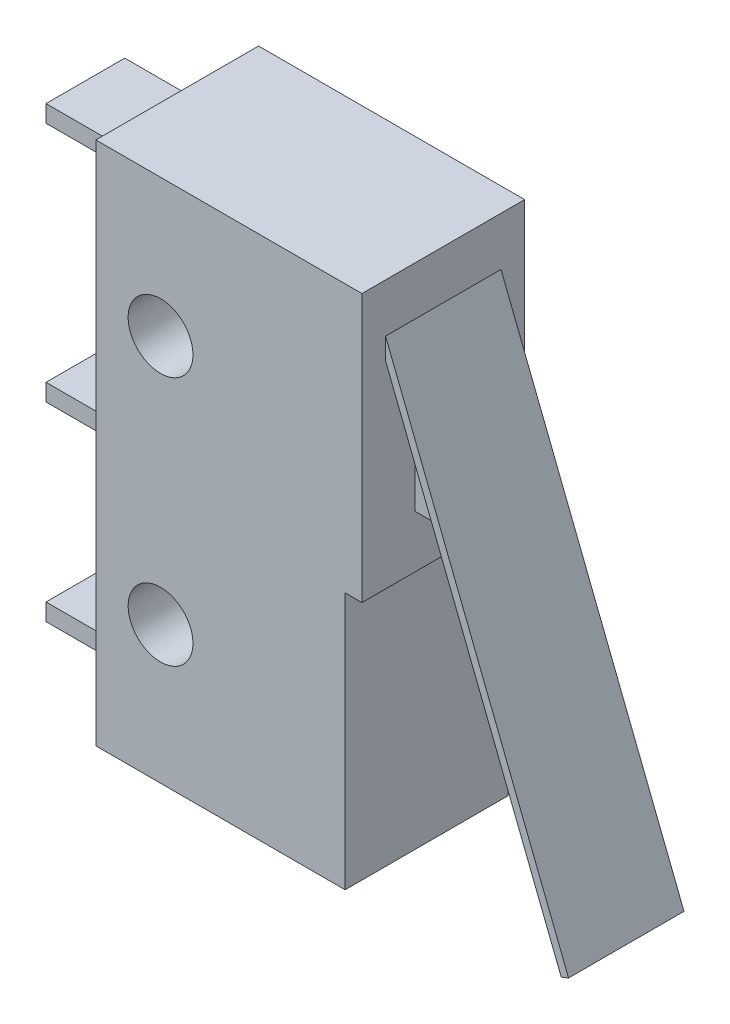
ISO-10303-21;
HEADER;
FILE_DESCRIPTION(('STEP AP214'),'2;1');
FILE_NAME('part.step','',(''),(''),'','','');
FILE_SCHEMA(('AUTOMOTIVE_DESIGN { 1 0 10303 214 1 1 1 1 }'));
ENDSEC;
DATA;
#1=APPLICATION_CONTEXT('core data for automotive mechanical design processes');
#2=APPLICATION_PROTOCOL_DEFINITION('international standard','automotive_design',2000,#1);
#3=PRODUCT_CONTEXT('',#1,'mechanical');
#4=PRODUCT('Part','Part','',(#3));
#5=PRODUCT_RELATED_PRODUCT_CATEGORY('part','',(#4));
#6=PRODUCT_DEFINITION_FORMATION('','',#4);
#7=PRODUCT_DEFINITION_CONTEXT('part definition',#1,'design');
#8=PRODUCT_DEFINITION('design','',#6,#7);
#9=PRODUCT_DEFINITION_SHAPE('','',#8);
#10=(LENGTH_UNIT() NAMED_UNIT(*) SI_UNIT(.MILLI.,.METRE.));
#11=(NAMED_UNIT(*) PLANE_ANGLE_UNIT() SI_UNIT($,.RADIAN.));
#12=(NAMED_UNIT(*) SI_UNIT($,.STERADIAN.) SOLID_ANGLE_UNIT());
#13=UNCERTAINTY_MEASURE_WITH_UNIT(LENGTH_MEASURE(1.E-05),#10,'distance_accuracy_value','');
#14=(GEOMETRIC_REPRESENTATION_CONTEXT(3) GLOBAL_UNCERTAINTY_ASSIGNED_CONTEXT((#13)) GLOBAL_UNIT_ASSIGNED_CONTEXT((#10,
#11,#12)) REPRESENTATION_CONTEXT('',''));
#15=CARTESIAN_POINT('',(0.,0.,0.));
#16=DIRECTION('',(0.,0.,1.));
#17=DIRECTION('',(1.,0.,0.));
#18=AXIS2_PLACEMENT_3D('',#15,#16,#17);
#19=CARTESIAN_POINT('',(-2.51649635036497,7.9684502392128,0.9));
#20=DIRECTION('',(-0.366577263450743,0.930387612729751,0.));
#21=DIRECTION('',(-0.930387612729751,-0.366577263450743,0.));
#22=AXIS2_PLACEMENT_3D('',#19,#20,#21);
#23=PLANE('',#22);
#24=DIRECTION('',(0.,0.,1.));
#25=VECTOR('',#24,1.);
#26=CARTESIAN_POINT('',(-2.79561263418389,7.85847706017758,0.9));
#27=LINE('',#26,#25);
#28=CARTESIAN_POINT('',(-2.79561263418389,7.85847706017758,0.9));
#29=VERTEX_POINT('',#28);
#30=CARTESIAN_POINT('',(-2.79561263418389,7.85847706017758,5.3));
#31=VERTEX_POINT('',#30);
#32=EDGE_CURVE('E54',#29,#31,#27,.T.);
#33=ORIENTED_EDGE('',*,*,#32,.T.);
#34=DIRECTION('',(-0.930387612729751,-0.366577263450743,0.));
#35=VECTOR('',#34,1.);
#36=CARTESIAN_POINT('',(-2.51649635036497,7.9684502392128,5.3));
#37=LINE('',#36,#35);
#38=CARTESIAN_POINT('',(-2.51649635036497,7.9684502392128,5.3));
#39=VERTEX_POINT('',#38);
#40=EDGE_CURVE('E96',#39,#31,#37,.T.);
#41=ORIENTED_EDGE('',*,*,#40,.F.);
#42=DIRECTION('',(0.,0.,1.));
#43=VECTOR('',#42,1.);
#44=CARTESIAN_POINT('',(-2.51649635036497,7.9684502392128,0.9));
#45=LINE('',#44,#43);
#46=CARTESIAN_POINT('',(-2.51649635036497,7.9684502392128,0.9));
#47=VERTEX_POINT('',#46);
#48=EDGE_CURVE('E12',#47,#39,#45,.T.);
#49=ORIENTED_EDGE('',*,*,#48,.F.);
#50=DIRECTION('',(-0.930387612729751,-0.366577263450743,0.));
#51=VECTOR('',#50,1.);
#52=CARTESIAN_POINT('',(-2.51649635036497,7.9684502392128,0.9));
#53=LINE('',#52,#51);
#54=EDGE_CURVE('E97',#47,#29,#53,.T.);
#55=ORIENTED_EDGE('',*,*,#54,.T.);
#56=EDGE_LOOP('',(#33,#41,#49,#55));
#57=FACE_BOUND('',#56,.T.);
#58=ADVANCED_FACE('F51',(#57),#23,.T.);
#59=CARTESIAN_POINT('',(-2.51649635036497,7.9684502392128,0.9));
#60=DIRECTION('',(0.930387612729752,0.36657726345074,0.));
#61=DIRECTION('',(-0.36657726345074,0.930387612729752,0.));
#62=AXIS2_PLACEMENT_3D('',#59,#60,#61);
#63=PLANE('',#62);
#64=ORIENTED_EDGE('',*,*,#48,.T.);
#65=DIRECTION('',(-0.36657726345074,0.930387612729752,0.));
#66=VECTOR('',#65,1.);
#67=CARTESIAN_POINT('',(-2.51649635036497,7.9684502392128,5.3));
#68=LINE('',#67,#66);
#69=CARTESIAN_POINT('',(4.45730950370691,-9.73134521218348,5.3));
#70=VERTEX_POINT('',#69);
#71=EDGE_CURVE('E115',#70,#39,#68,.T.);
#72=ORIENTED_EDGE('',*,*,#71,.F.);
#73=DIRECTION('',(0.,0.,1.));
#74=VECTOR('',#73,1.);
#75=CARTESIAN_POINT('',(4.45730950370691,-9.73134521218348,0.9));
#76=LINE('',#75,#74);
#77=CARTESIAN_POINT('',(4.45730950370691,-9.73134521218348,0.9));
#78=VERTEX_POINT('',#77);
#79=EDGE_CURVE('E60',#78,#70,#76,.T.);
#80=ORIENTED_EDGE('',*,*,#79,.F.);
#81=DIRECTION('',(-0.36657726345074,0.930387612729752,0.));
#82=VECTOR('',#81,1.);
#83=CARTESIAN_POINT('',(-2.51649635036497,7.9684502392128,0.9));
#84=LINE('',#83,#82);
#85=EDGE_CURVE('E103',#78,#47,#84,.T.);
#86=ORIENTED_EDGE('',*,*,#85,.T.);
#87=EDGE_LOOP('',(#64,#72,#80,#86));
#88=FACE_BOUND('',#87,.T.);
#89=ADVANCED_FACE('F135',(#88),#63,.T.);
#90=CARTESIAN_POINT('',(4.45730950370691,-9.73134521218348,0.9));
#91=DIRECTION('',(0.36657726345074,-0.930387612729752,0.));
#92=DIRECTION('',(0.930387612729752,0.36657726345074,0.));
#93=AXIS2_PLACEMENT_3D('',#90,#91,#92);
#94=PLANE('',#93);
#95=ORIENTED_EDGE('',*,*,#79,.T.);
#96=DIRECTION('',(0.930387612729752,0.36657726345074,0.));
#97=VECTOR('',#96,1.);
#98=CARTESIAN_POINT('',(4.45730950370691,-9.73134521218348,5.3));
#99=LINE('',#98,#97);
#100=CARTESIAN_POINT('',(4.17819321988797,-9.8413183912187,5.3));
#101=VERTEX_POINT('',#100);
#102=EDGE_CURVE('E111',#101,#70,#99,.T.);
#103=ORIENTED_EDGE('',*,*,#102,.F.);
#104=DIRECTION('',(0.,0.,1.));
#105=VECTOR('',#104,1.);
#106=CARTESIAN_POINT('',(4.17819321988797,-9.8413183912187,0.9));
#107=LINE('',#106,#105);
#108=CARTESIAN_POINT('',(4.17819321988797,-9.8413183912187,0.9));
#109=VERTEX_POINT('',#108);
#110=EDGE_CURVE('E102',#109,#101,#107,.T.);
#111=ORIENTED_EDGE('',*,*,#110,.F.);
#112=DIRECTION('',(0.930387612729752,0.36657726345074,0.));
#113=VECTOR('',#112,1.);
#114=CARTESIAN_POINT('',(4.45730950370691,-9.73134521218348,0.9));
#115=LINE('',#114,#113);
#116=EDGE_CURVE('E128',#109,#78,#115,.T.);
#117=ORIENTED_EDGE('',*,*,#116,.T.);
#118=EDGE_LOOP('',(#95,#103,#111,#117));
#119=FACE_BOUND('',#118,.T.);
#120=ADVANCED_FACE('F132',(#119),#94,.T.);
#121=CARTESIAN_POINT('',(4.17819321988797,-9.8413183912187,0.9));
#122=DIRECTION('',(-0.930387612729752,-0.366577263450739,0.));
#123=DIRECTION('',(0.36657726345074,-0.930387612729752,0.));
#124=AXIS2_PLACEMENT_3D('',#121,#122,#123);
#125=PLANE('',#124);
#126=ORIENTED_EDGE('',*,*,#110,.T.);
#127=DIRECTION('',(0.36657726345074,-0.930387612729752,0.));
#128=VECTOR('',#127,1.);
#129=CARTESIAN_POINT('',(4.17819321988797,-9.8413183912187,5.3));
#130=LINE('',#129,#128);
#131=EDGE_CURVE('E105',#31,#101,#130,.T.);
#132=ORIENTED_EDGE('',*,*,#131,.F.);
#133=ORIENTED_EDGE('',*,*,#32,.F.);
#134=DIRECTION('',(0.36657726345074,-0.930387612729752,0.));
#135=VECTOR('',#134,1.);
#136=CARTESIAN_POINT('',(4.17819321988797,-9.8413183912187,0.9));
#137=LINE('',#136,#135);
#138=EDGE_CURVE('E125',#29,#109,#137,.T.);
#139=ORIENTED_EDGE('',*,*,#138,.T.);
#140=EDGE_LOOP('',(#126,#132,#133,#139));
#141=FACE_BOUND('',#140,.T.);
#142=ADVANCED_FACE('F106',(#141),#125,.T.);
#143=CARTESIAN_POINT('',(0.,0.,0.9));
#144=DIRECTION('',(0.,0.,-1.));
#145=DIRECTION('',(-1.,0.,0.));
#146=AXIS2_PLACEMENT_3D('',#143,#144,#145);
#147=PLANE('',#146);
#148=ORIENTED_EDGE('',*,*,#54,.F.);
#149=ORIENTED_EDGE('',*,*,#85,.F.);
#150=ORIENTED_EDGE('',*,*,#116,.F.);
#151=ORIENTED_EDGE('',*,*,#138,.F.);
#152=EDGE_LOOP('',(#148,#149,#150,#151));
#153=FACE_BOUND('',#152,.T.);
#154=ADVANCED_FACE('F137',(#153),#147,.T.);
#155=CARTESIAN_POINT('',(0.,0.,5.3));
#156=DIRECTION('',(0.,0.,-1.));
#157=DIRECTION('',(-1.,0.,0.));
#158=AXIS2_PLACEMENT_3D('',#155,#156,#157);
#159=PLANE('',#158);
#160=ORIENTED_EDGE('',*,*,#40,.T.);
#161=ORIENTED_EDGE('',*,*,#131,.T.);
#162=ORIENTED_EDGE('',*,*,#102,.T.);
#163=ORIENTED_EDGE('',*,*,#71,.T.);
#164=EDGE_LOOP('',(#160,#161,#162,#163));
#165=FACE_BOUND('',#164,.T.);
#166=ADVANCED_FACE('F114',(#165),#159,.F.);
#167=CLOSED_SHELL('',(#58,#89,#120,#142,#154,#166));
#168=MANIFOLD_SOLID_BREP('B2',#167);
#169=CARTESIAN_POINT('',(-16.156496350365,-7.97700729927007,1.6));
#170=DIRECTION('',(0.,0.,1.));
#171=DIRECTION('',(0.,-1.,0.));
#172=AXIS2_PLACEMENT_3D('',#169,#170,#171);
#173=PLANE('',#172);
#174=DIRECTION('',(0.,-1.,0.));
#175=VECTOR('',#174,1.);
#176=CARTESIAN_POINT('',(-12.656496350365,-7.97700729927007,1.6));
#177=LINE('',#176,#175);
#178=CARTESIAN_POINT('',(-12.656496350365,-7.97700729927007,1.6));
#179=VERTEX_POINT('',#178);
#180=CARTESIAN_POINT('',(-12.656496350365,-8.62700729927007,1.6));
#181=VERTEX_POINT('',#180);
#182=EDGE_CURVE('E261',#179,#181,#177,.T.);
#183=ORIENTED_EDGE('',*,*,#182,.T.);
#184=DIRECTION('',(1.,0.,0.));
#185=VECTOR('',#184,1.);
#186=CARTESIAN_POINT('',(-16.156496350365,-8.62700729927007,1.6));
#187=LINE('',#186,#185);
#188=CARTESIAN_POINT('',(-16.156496350365,-8.62700729927007,1.6));
#189=VERTEX_POINT('',#188);
#190=EDGE_CURVE('E49',#189,#181,#187,.T.);
#191=ORIENTED_EDGE('',*,*,#190,.F.);
#192=DIRECTION('',(0.,-1.,0.));
#193=VECTOR('',#192,1.);
#194=CARTESIAN_POINT('',(-16.156496350365,-7.97700729927007,1.6));
#195=LINE('',#194,#193);
#196=CARTESIAN_POINT('',(-16.156496350365,-7.97700729927007,1.6));
#197=VERTEX_POINT('',#196);
#198=EDGE_CURVE('E249',#197,#189,#195,.T.);
#199=ORIENTED_EDGE('',*,*,#198,.F.);
#200=DIRECTION('',(1.,0.,0.));
#201=VECTOR('',#200,1.);
#202=CARTESIAN_POINT('',(-16.156496350365,-7.97700729927007,1.6));
#203=LINE('',#202,#201);
#204=EDGE_CURVE('E257',#197,#179,#203,.T.);
#205=ORIENTED_EDGE('',*,*,#204,.T.);
#206=EDGE_LOOP('',(#183,#191,#199,#205));
#207=FACE_BOUND('',#206,.T.);
#208=ADVANCED_FACE('F198',(#207),#173,.F.);
#209=CARTESIAN_POINT('',(-16.156496350365,-8.62700729927007,1.6));
#210=DIRECTION('',(0.,1.,0.));
#211=DIRECTION('',(-1.,0.,0.));
#212=AXIS2_PLACEMENT_3D('',#209,#210,#211);
#213=PLANE('',#212);
#214=DIRECTION('',(0.,0.,1.));
#215=VECTOR('',#214,1.);
#216=CARTESIAN_POINT('',(-12.656496350365,-8.62700729927007,1.6));
#217=LINE('',#216,#215);
#218=CARTESIAN_POINT('',(-12.656496350365,-8.62700729927007,4.6));
#219=VERTEX_POINT('',#218);
#220=EDGE_CURVE('E253',#181,#219,#217,.T.);
#221=ORIENTED_EDGE('',*,*,#220,.T.);
#222=DIRECTION('',(1.,0.,0.));
#223=VECTOR('',#222,1.);
#224=CARTESIAN_POINT('',(-16.156496350365,-8.62700729927007,4.6));
#225=LINE('',#224,#223);
#226=CARTESIAN_POINT('',(-16.156496350365,-8.62700729927007,4.6));
#227=VERTEX_POINT('',#226);
#228=EDGE_CURVE('E206',#227,#219,#225,.T.);
#229=ORIENTED_EDGE('',*,*,#228,.F.);
#230=DIRECTION('',(0.,0.,1.));
#231=VECTOR('',#230,1.);
#232=CARTESIAN_POINT('',(-16.156496350365,-8.62700729927007,1.6));
#233=LINE('',#232,#231);
#234=EDGE_CURVE('E244',#189,#227,#233,.T.);
#235=ORIENTED_EDGE('',*,*,#234,.F.);
#236=ORIENTED_EDGE('',*,*,#190,.T.);
#237=EDGE_LOOP('',(#221,#229,#235,#236));
#238=FACE_BOUND('',#237,.T.);
#239=ADVANCED_FACE('F252',(#238),#213,.F.);
#240=CARTESIAN_POINT('',(-16.156496350365,-7.97700729927007,4.6));
#241=DIRECTION('',(0.,0.,-1.));
#242=DIRECTION('',(-1.,0.,0.));
#243=AXIS2_PLACEMENT_3D('',#240,#241,#242);
#244=PLANE('',#243);
#245=DIRECTION('',(0.,1.,0.));
#246=VECTOR('',#245,1.);
#247=CARTESIAN_POINT('',(-12.656496350365,-7.97700729927007,4.6));
#248=LINE('',#247,#246);
#249=CARTESIAN_POINT('',(-12.656496350365,-7.97700729927007,4.6));
#250=VERTEX_POINT('',#249);
#251=EDGE_CURVE('E231',#219,#250,#248,.T.);
#252=ORIENTED_EDGE('',*,*,#251,.T.);
#253=DIRECTION('',(1.,0.,0.));
#254=VECTOR('',#253,1.);
#255=CARTESIAN_POINT('',(-16.156496350365,-7.97700729927007,4.6));
#256=LINE('',#255,#254);
#257=CARTESIAN_POINT('',(-16.156496350365,-7.97700729927007,4.6));
#258=VERTEX_POINT('',#257);
#259=EDGE_CURVE('E254',#258,#250,#256,.T.);
#260=ORIENTED_EDGE('',*,*,#259,.F.);
#261=DIRECTION('',(0.,1.,0.));
#262=VECTOR('',#261,1.);
#263=CARTESIAN_POINT('',(-16.156496350365,-7.97700729927007,4.6));
#264=LINE('',#263,#262);
#265=EDGE_CURVE('E247',#227,#258,#264,.T.);
#266=ORIENTED_EDGE('',*,*,#265,.F.);
#267=ORIENTED_EDGE('',*,*,#228,.T.);
#268=EDGE_LOOP('',(#252,#260,#266,#267));
#269=FACE_BOUND('',#268,.T.);
#270=ADVANCED_FACE('F255',(#269),#244,.F.);
#271=CARTESIAN_POINT('',(-16.156496350365,-7.97700729927007,1.6));
#272=DIRECTION('',(0.,-1.,0.));
#273=DIRECTION('',(1.,0.,0.));
#274=AXIS2_PLACEMENT_3D('',#271,#272,#273);
#275=PLANE('',#274);
#276=DIRECTION('',(0.,0.,-1.));
#277=VECTOR('',#276,1.);
#278=CARTESIAN_POINT('',(-12.656496350365,-7.97700729927007,1.6));
#279=LINE('',#278,#277);
#280=EDGE_CURVE('E237',#250,#179,#279,.T.);
#281=ORIENTED_EDGE('',*,*,#280,.T.);
#282=ORIENTED_EDGE('',*,*,#204,.F.);
#283=DIRECTION('',(0.,0.,-1.));
#284=VECTOR('',#283,1.);
#285=CARTESIAN_POINT('',(-16.156496350365,-7.97700729927007,1.6));
#286=LINE('',#285,#284);
#287=EDGE_CURVE('E214',#258,#197,#286,.T.);
#288=ORIENTED_EDGE('',*,*,#287,.F.);
#289=ORIENTED_EDGE('',*,*,#259,.T.);
#290=EDGE_LOOP('',(#281,#282,#288,#289));
#291=FACE_BOUND('',#290,.T.);
#292=ADVANCED_FACE('F268',(#291),#275,.F.);
#293=CARTESIAN_POINT('',(-16.156496350365,0.,0.));
#294=DIRECTION('',(-1.,0.,0.));
#295=DIRECTION('',(0.,0.,1.));
#296=AXIS2_PLACEMENT_3D('',#293,#294,#295);
#297=PLANE('',#296);
#298=ORIENTED_EDGE('',*,*,#198,.T.);
#299=ORIENTED_EDGE('',*,*,#234,.T.);
#300=ORIENTED_EDGE('',*,*,#265,.T.);
#301=ORIENTED_EDGE('',*,*,#287,.T.);
#302=EDGE_LOOP('',(#298,#299,#300,#301));
#303=FACE_BOUND('',#302,.T.);
#304=ADVANCED_FACE('F245',(#303),#297,.T.);
#305=CARTESIAN_POINT('',(-12.656496350365,0.,0.));
#306=DIRECTION('',(-1.,0.,0.));
#307=DIRECTION('',(0.,0.,1.));
#308=AXIS2_PLACEMENT_3D('',#305,#306,#307);
#309=PLANE('',#308);
#310=ORIENTED_EDGE('',*,*,#182,.F.);
#311=ORIENTED_EDGE('',*,*,#280,.F.);
#312=ORIENTED_EDGE('',*,*,#251,.F.);
#313=ORIENTED_EDGE('',*,*,#220,.F.);
#314=EDGE_LOOP('',(#310,#311,#312,#313));
#315=FACE_BOUND('',#314,.T.);
#316=ADVANCED_FACE('F271',(#315),#309,.F.);
#317=CLOSED_SHELL('',(#208,#239,#270,#292,#304,#316));
#318=MANIFOLD_SOLID_BREP('B6',#317);
#319=CARTESIAN_POINT('',(-16.156496350365,-0.727007299270072,1.6));
#320=DIRECTION('',(0.,0.,1.));
#321=DIRECTION('',(1.,0.,0.));
#322=AXIS2_PLACEMENT_3D('',#319,#320,#321);
#323=PLANE('',#322);
#324=DIRECTION('',(0.,-1.,0.));
#325=VECTOR('',#324,1.);
#326=CARTESIAN_POINT('',(-12.656496350365,-0.727007299270071,1.6));
#327=LINE('',#326,#325);
#328=CARTESIAN_POINT('',(-12.656496350365,-0.727007299270071,1.6));
#329=VERTEX_POINT('',#328);
#330=CARTESIAN_POINT('',(-12.656496350365,-1.37700729927007,1.6));
#331=VERTEX_POINT('',#330);
#332=EDGE_CURVE('E394',#329,#331,#327,.T.);
#333=ORIENTED_EDGE('',*,*,#332,.T.);
#334=DIRECTION('',(1.,0.,0.));
#335=VECTOR('',#334,1.);
#336=CARTESIAN_POINT('',(-16.156496350365,-1.37700729927007,1.6));
#337=LINE('',#336,#335);
#338=CARTESIAN_POINT('',(-16.156496350365,-1.37700729927007,1.6));
#339=VERTEX_POINT('',#338);
#340=EDGE_CURVE('E196',#339,#331,#337,.T.);
#341=ORIENTED_EDGE('',*,*,#340,.F.);
#342=DIRECTION('',(0.,-1.,0.));
#343=VECTOR('',#342,1.);
#344=CARTESIAN_POINT('',(-16.156496350365,-0.727007299270072,1.6));
#345=LINE('',#344,#343);
#346=CARTESIAN_POINT('',(-16.156496350365,-0.727007299270072,1.6));
#347=VERTEX_POINT('',#346);
#348=EDGE_CURVE('E382',#347,#339,#345,.T.);
#349=ORIENTED_EDGE('',*,*,#348,.F.);
#350=DIRECTION('',(1.,0.,0.));
#351=VECTOR('',#350,1.);
#352=CARTESIAN_POINT('',(-16.156496350365,-0.727007299270072,1.6));
#353=LINE('',#352,#351);
#354=EDGE_CURVE('E390',#347,#329,#353,.T.);
#355=ORIENTED_EDGE('',*,*,#354,.T.);
#356=EDGE_LOOP('',(#333,#341,#349,#355));
#357=FACE_BOUND('',#356,.T.);
#358=ADVANCED_FACE('F331',(#357),#323,.F.);
#359=CARTESIAN_POINT('',(-16.156496350365,-1.37700729927007,1.6));
#360=DIRECTION('',(0.,1.,0.));
#361=DIRECTION('',(-1.,0.,0.));
#362=AXIS2_PLACEMENT_3D('',#359,#360,#361);
#363=PLANE('',#362);
#364=DIRECTION('',(0.,0.,1.));
#365=VECTOR('',#364,1.);
#366=CARTESIAN_POINT('',(-12.656496350365,-1.37700729927007,1.6));
#367=LINE('',#366,#365);
#368=CARTESIAN_POINT('',(-12.656496350365,-1.37700729927007,4.6));
#369=VERTEX_POINT('',#368);
#370=EDGE_CURVE('E386',#331,#369,#367,.T.);
#371=ORIENTED_EDGE('',*,*,#370,.T.);
#372=DIRECTION('',(1.,0.,0.));
#373=VECTOR('',#372,1.);
#374=CARTESIAN_POINT('',(-16.156496350365,-1.37700729927007,4.6));
#375=LINE('',#374,#373);
#376=CARTESIAN_POINT('',(-16.156496350365,-1.37700729927007,4.6));
#377=VERTEX_POINT('',#376);
#378=EDGE_CURVE('E339',#377,#369,#375,.T.);
#379=ORIENTED_EDGE('',*,*,#378,.F.);
#380=DIRECTION('',(0.,0.,1.));
#381=VECTOR('',#380,1.);
#382=CARTESIAN_POINT('',(-16.156496350365,-1.37700729927007,1.6));
#383=LINE('',#382,#381);
#384=EDGE_CURVE('E377',#339,#377,#383,.T.);
#385=ORIENTED_EDGE('',*,*,#384,.F.);
#386=ORIENTED_EDGE('',*,*,#340,.T.);
#387=EDGE_LOOP('',(#371,#379,#385,#386));
#388=FACE_BOUND('',#387,.T.);
#389=ADVANCED_FACE('F385',(#388),#363,.F.);
#390=CARTESIAN_POINT('',(-16.156496350365,-0.727007299270072,4.6));
#391=DIRECTION('',(0.,0.,-1.));
#392=DIRECTION('',(-1.,0.,0.));
#393=AXIS2_PLACEMENT_3D('',#390,#391,#392);
#394=PLANE('',#393);
#395=DIRECTION('',(0.,1.,0.));
#396=VECTOR('',#395,1.);
#397=CARTESIAN_POINT('',(-12.656496350365,-0.727007299270071,4.6));
#398=LINE('',#397,#396);
#399=CARTESIAN_POINT('',(-12.656496350365,-0.727007299270071,4.6));
#400=VERTEX_POINT('',#399);
#401=EDGE_CURVE('E364',#369,#400,#398,.T.);
#402=ORIENTED_EDGE('',*,*,#401,.T.);
#403=DIRECTION('',(1.,0.,0.));
#404=VECTOR('',#403,1.);
#405=CARTESIAN_POINT('',(-16.156496350365,-0.727007299270072,4.6));
#406=LINE('',#405,#404);
#407=CARTESIAN_POINT('',(-16.156496350365,-0.727007299270072,4.6));
#408=VERTEX_POINT('',#407);
#409=EDGE_CURVE('E387',#408,#400,#406,.T.);
#410=ORIENTED_EDGE('',*,*,#409,.F.);
#411=DIRECTION('',(0.,1.,0.));
#412=VECTOR('',#411,1.);
#413=CARTESIAN_POINT('',(-16.156496350365,-0.727007299270072,4.6));
#414=LINE('',#413,#412);
#415=EDGE_CURVE('E380',#377,#408,#414,.T.);
#416=ORIENTED_EDGE('',*,*,#415,.F.);
#417=ORIENTED_EDGE('',*,*,#378,.T.);
#418=EDGE_LOOP('',(#402,#410,#416,#417));
#419=FACE_BOUND('',#418,.T.);
#420=ADVANCED_FACE('F388',(#419),#394,.F.);
#421=CARTESIAN_POINT('',(-16.156496350365,-0.727007299270072,1.6));
#422=DIRECTION('',(0.,-1.,0.));
#423=DIRECTION('',(1.,0.,0.));
#424=AXIS2_PLACEMENT_3D('',#421,#422,#423);
#425=PLANE('',#424);
#426=DIRECTION('',(0.,0.,-1.));
#427=VECTOR('',#426,1.);
#428=CARTESIAN_POINT('',(-12.656496350365,-0.727007299270071,1.6));
#429=LINE('',#428,#427);
#430=EDGE_CURVE('E370',#400,#329,#429,.T.);
#431=ORIENTED_EDGE('',*,*,#430,.T.);
#432=ORIENTED_EDGE('',*,*,#354,.F.);
#433=DIRECTION('',(0.,0.,-1.));
#434=VECTOR('',#433,1.);
#435=CARTESIAN_POINT('',(-16.156496350365,-0.727007299270072,1.6));
#436=LINE('',#435,#434);
#437=EDGE_CURVE('E347',#408,#347,#436,.T.);
#438=ORIENTED_EDGE('',*,*,#437,.F.);
#439=ORIENTED_EDGE('',*,*,#409,.T.);
#440=EDGE_LOOP('',(#431,#432,#438,#439));
#441=FACE_BOUND('',#440,.T.);
#442=ADVANCED_FACE('F401',(#441),#425,.F.);
#443=CARTESIAN_POINT('',(-16.156496350365,0.,0.));
#444=DIRECTION('',(-1.,0.,0.));
#445=DIRECTION('',(0.,0.,1.));
#446=AXIS2_PLACEMENT_3D('',#443,#444,#445);
#447=PLANE('',#446);
#448=ORIENTED_EDGE('',*,*,#348,.T.);
#449=ORIENTED_EDGE('',*,*,#384,.T.);
#450=ORIENTED_EDGE('',*,*,#415,.T.);
#451=ORIENTED_EDGE('',*,*,#437,.T.);
#452=EDGE_LOOP('',(#448,#449,#450,#451));
#453=FACE_BOUND('',#452,.T.);
#454=ADVANCED_FACE('F378',(#453),#447,.T.);
#455=CARTESIAN_POINT('',(-12.656496350365,0.,0.));
#456=DIRECTION('',(-1.,0.,0.));
#457=DIRECTION('',(0.,0.,1.));
#458=AXIS2_PLACEMENT_3D('',#455,#456,#457);
#459=PLANE('',#458);
#460=ORIENTED_EDGE('',*,*,#332,.F.);
#461=ORIENTED_EDGE('',*,*,#430,.F.);
#462=ORIENTED_EDGE('',*,*,#401,.F.);
#463=ORIENTED_EDGE('',*,*,#370,.F.);
#464=EDGE_LOOP('',(#460,#461,#462,#463));
#465=FACE_BOUND('',#464,.T.);
#466=ADVANCED_FACE('F404',(#465),#459,.F.);
#467=CLOSED_SHELL('',(#358,#389,#420,#442,#454,#466));
#468=MANIFOLD_SOLID_BREP('B43',#467);
#469=CARTESIAN_POINT('',(-16.156496350365,8.47299270072993,1.6));
#470=DIRECTION('',(0.,0.,1.));
#471=DIRECTION('',(0.,-1.,0.));
#472=AXIS2_PLACEMENT_3D('',#469,#470,#471);
#473=PLANE('',#472);
#474=DIRECTION('',(0.,-1.,0.));
#475=VECTOR('',#474,1.);
#476=CARTESIAN_POINT('',(-12.656496350365,8.47299270072993,1.6));
#477=LINE('',#476,#475);
#478=CARTESIAN_POINT('',(-12.656496350365,8.47299270072993,1.6));
#479=VERTEX_POINT('',#478);
#480=CARTESIAN_POINT('',(-12.656496350365,7.82299270072993,1.6));
#481=VERTEX_POINT('',#480);
#482=EDGE_CURVE('E526',#479,#481,#477,.T.);
#483=ORIENTED_EDGE('',*,*,#482,.T.);
#484=DIRECTION('',(1.,0.,0.));
#485=VECTOR('',#484,1.);
#486=CARTESIAN_POINT('',(-16.156496350365,7.82299270072993,1.6));
#487=LINE('',#486,#485);
#488=CARTESIAN_POINT('',(-16.156496350365,7.82299270072993,1.6));
#489=VERTEX_POINT('',#488);
#490=EDGE_CURVE('E329',#489,#481,#487,.T.);
#491=ORIENTED_EDGE('',*,*,#490,.F.);
#492=DIRECTION('',(0.,-1.,0.));
#493=VECTOR('',#492,1.);
#494=CARTESIAN_POINT('',(-16.156496350365,8.47299270072993,1.6));
#495=LINE('',#494,#493);
#496=CARTESIAN_POINT('',(-16.156496350365,8.47299270072993,1.6));
#497=VERTEX_POINT('',#496);
#498=EDGE_CURVE('E514',#497,#489,#495,.T.);
#499=ORIENTED_EDGE('',*,*,#498,.F.);
#500=DIRECTION('',(1.,0.,0.));
#501=VECTOR('',#500,1.);
#502=CARTESIAN_POINT('',(-16.156496350365,8.47299270072993,1.6));
#503=LINE('',#502,#501);
#504=EDGE_CURVE('E522',#497,#479,#503,.T.);
#505=ORIENTED_EDGE('',*,*,#504,.T.);
#506=EDGE_LOOP('',(#483,#491,#499,#505));
#507=FACE_BOUND('',#506,.T.);
#508=ADVANCED_FACE('F463',(#507),#473,.F.);
#509=CARTESIAN_POINT('',(-16.156496350365,7.82299270072993,1.6));
#510=DIRECTION('',(0.,1.,0.));
#511=DIRECTION('',(-1.,0.,0.));
#512=AXIS2_PLACEMENT_3D('',#509,#510,#511);
#513=PLANE('',#512);
#514=DIRECTION('',(0.,0.,1.));
#515=VECTOR('',#514,1.);
#516=CARTESIAN_POINT('',(-12.656496350365,7.82299270072993,1.6));
#517=LINE('',#516,#515);
#518=CARTESIAN_POINT('',(-12.656496350365,7.82299270072993,4.6));
#519=VERTEX_POINT('',#518);
#520=EDGE_CURVE('E518',#481,#519,#517,.T.);
#521=ORIENTED_EDGE('',*,*,#520,.T.);
#522=DIRECTION('',(1.,0.,0.));
#523=VECTOR('',#522,1.);
#524=CARTESIAN_POINT('',(-16.156496350365,7.82299270072993,4.6));
#525=LINE('',#524,#523);
#526=CARTESIAN_POINT('',(-16.156496350365,7.82299270072993,4.6));
#527=VERTEX_POINT('',#526);
#528=EDGE_CURVE('E471',#527,#519,#525,.T.);
#529=ORIENTED_EDGE('',*,*,#528,.F.);
#530=DIRECTION('',(0.,0.,1.));
#531=VECTOR('',#530,1.);
#532=CARTESIAN_POINT('',(-16.156496350365,7.82299270072993,1.6));
#533=LINE('',#532,#531);
#534=EDGE_CURVE('E509',#489,#527,#533,.T.);
#535=ORIENTED_EDGE('',*,*,#534,.F.);
#536=ORIENTED_EDGE('',*,*,#490,.T.);
#537=EDGE_LOOP('',(#521,#529,#535,#536));
#538=FACE_BOUND('',#537,.T.);
#539=ADVANCED_FACE('F517',(#538),#513,.F.);
#540=CARTESIAN_POINT('',(-16.156496350365,8.47299270072993,4.6));
#541=DIRECTION('',(0.,0.,-1.));
#542=DIRECTION('',(-1.,0.,0.));
#543=AXIS2_PLACEMENT_3D('',#540,#541,#542);
#544=PLANE('',#543);
#545=DIRECTION('',(0.,1.,0.));
#546=VECTOR('',#545,1.);
#547=CARTESIAN_POINT('',(-12.656496350365,8.47299270072993,4.6));
#548=LINE('',#547,#546);
#549=CARTESIAN_POINT('',(-12.656496350365,8.47299270072993,4.6));
#550=VERTEX_POINT('',#549);
#551=EDGE_CURVE('E496',#519,#550,#548,.T.);
#552=ORIENTED_EDGE('',*,*,#551,.T.);
#553=DIRECTION('',(1.,0.,0.));
#554=VECTOR('',#553,1.);
#555=CARTESIAN_POINT('',(-16.156496350365,8.47299270072993,4.6));
#556=LINE('',#555,#554);
#557=CARTESIAN_POINT('',(-16.156496350365,8.47299270072993,4.6));
#558=VERTEX_POINT('',#557);
#559=EDGE_CURVE('E519',#558,#550,#556,.T.);
#560=ORIENTED_EDGE('',*,*,#559,.F.);
#561=DIRECTION('',(0.,1.,0.));
#562=VECTOR('',#561,1.);
#563=CARTESIAN_POINT('',(-16.156496350365,8.47299270072993,4.6));
#564=LINE('',#563,#562);
#565=EDGE_CURVE('E512',#527,#558,#564,.T.);
#566=ORIENTED_EDGE('',*,*,#565,.F.);
#567=ORIENTED_EDGE('',*,*,#528,.T.);
#568=EDGE_LOOP('',(#552,#560,#566,#567));
#569=FACE_BOUND('',#568,.T.);
#570=ADVANCED_FACE('F520',(#569),#544,.F.);
#571=CARTESIAN_POINT('',(-16.156496350365,8.47299270072993,1.6));
#572=DIRECTION('',(0.,-1.,0.));
#573=DIRECTION('',(1.,0.,0.));
#574=AXIS2_PLACEMENT_3D('',#571,#572,#573);
#575=PLANE('',#574);
#576=DIRECTION('',(0.,0.,-1.));
#577=VECTOR('',#576,1.);
#578=CARTESIAN_POINT('',(-12.656496350365,8.47299270072993,1.6));
#579=LINE('',#578,#577);
#580=EDGE_CURVE('E502',#550,#479,#579,.T.);
#581=ORIENTED_EDGE('',*,*,#580,.T.);
#582=ORIENTED_EDGE('',*,*,#504,.F.);
#583=DIRECTION('',(0.,0.,-1.));
#584=VECTOR('',#583,1.);
#585=CARTESIAN_POINT('',(-16.156496350365,8.47299270072993,1.6));
#586=LINE('',#585,#584);
#587=EDGE_CURVE('E479',#558,#497,#586,.T.);
#588=ORIENTED_EDGE('',*,*,#587,.F.);
#589=ORIENTED_EDGE('',*,*,#559,.T.);
#590=EDGE_LOOP('',(#581,#582,#588,#589));
#591=FACE_BOUND('',#590,.T.);
#592=ADVANCED_FACE('F533',(#591),#575,.F.);
#593=CARTESIAN_POINT('',(-16.156496350365,0.,0.));
#594=DIRECTION('',(-1.,0.,0.));
#595=DIRECTION('',(0.,0.,1.));
#596=AXIS2_PLACEMENT_3D('',#593,#594,#595);
#597=PLANE('',#596);
#598=ORIENTED_EDGE('',*,*,#498,.T.);
#599=ORIENTED_EDGE('',*,*,#534,.T.);
#600=ORIENTED_EDGE('',*,*,#565,.T.);
#601=ORIENTED_EDGE('',*,*,#587,.T.);
#602=EDGE_LOOP('',(#598,#599,#600,#601));
#603=FACE_BOUND('',#602,.T.);
#604=ADVANCED_FACE('F510',(#603),#597,.T.);
#605=CARTESIAN_POINT('',(-12.656496350365,0.,0.));
#606=DIRECTION('',(-1.,0.,0.));
#607=DIRECTION('',(0.,0.,1.));
#608=AXIS2_PLACEMENT_3D('',#605,#606,#607);
#609=PLANE('',#608);
#610=ORIENTED_EDGE('',*,*,#482,.F.);
#611=ORIENTED_EDGE('',*,*,#580,.F.);
#612=ORIENTED_EDGE('',*,*,#551,.F.);
#613=ORIENTED_EDGE('',*,*,#520,.F.);
#614=EDGE_LOOP('',(#610,#611,#612,#613));
#615=FACE_BOUND('',#614,.T.);
#616=ADVANCED_FACE('F536',(#615),#609,.F.);
#617=CLOSED_SHELL('',(#508,#539,#570,#592,#604,#616));
#618=MANIFOLD_SOLID_BREP('B190',#617);
#619=CARTESIAN_POINT('',(-2.51649635036497,9.82299270072993,6.2));
#620=DIRECTION('',(-1.,0.,0.));
#621=DIRECTION('',(0.,-1.,0.));
#622=AXIS2_PLACEMENT_3D('',#619,#620,#621);
#623=PLANE('',#622);
#624=DIRECTION('',(0.,1.,0.));
#625=VECTOR('',#624,1.);
#626=CARTESIAN_POINT('',(-2.51649635036497,9.82299270072993,0.));
#627=LINE('',#626,#625);
#628=CARTESIAN_POINT('',(-2.51649635036497,-0.377007299270069,0.));
#629=VERTEX_POINT('',#628);
#630=CARTESIAN_POINT('',(-2.51649635036497,9.82299270072993,0.));
#631=VERTEX_POINT('',#630);
#632=EDGE_CURVE('E767',#629,#631,#627,.T.);
#633=ORIENTED_EDGE('',*,*,#632,.T.);
#634=DIRECTION('',(0.,0.,-1.));
#635=VECTOR('',#634,1.);
#636=CARTESIAN_POINT('',(-2.51649635036497,9.82299270072993,6.2));
#637=LINE('',#636,#635);
#638=CARTESIAN_POINT('',(-2.51649635036497,9.82299270072993,6.2));
#639=VERTEX_POINT('',#638);
#640=EDGE_CURVE('E775',#639,#631,#637,.T.);
#641=ORIENTED_EDGE('',*,*,#640,.F.);
#642=DIRECTION('',(0.,1.,0.));
#643=VECTOR('',#642,1.);
#644=CARTESIAN_POINT('',(-2.51649635036497,9.82299270072993,6.2));
#645=LINE('',#644,#643);
#646=CARTESIAN_POINT('',(-2.51649635036497,-0.377007299270069,6.2));
#647=VERTEX_POINT('',#646);
#648=EDGE_CURVE('E750',#647,#639,#645,.T.);
#649=ORIENTED_EDGE('',*,*,#648,.F.);
#650=DIRECTION('',(0.,0.,-1.));
#651=VECTOR('',#650,1.);
#652=CARTESIAN_POINT('',(-2.51649635036497,-0.377007299270069,6.2));
#653=LINE('',#652,#651);
#654=EDGE_CURVE('E778',#647,#629,#653,.T.);
#655=ORIENTED_EDGE('',*,*,#654,.T.);
#656=EDGE_LOOP('',(#633,#641,#649,#655));
#657=FACE_BOUND('',#656,.T.);
#658=DIRECTION('',(0.,-1.,0.));
#659=VECTOR('',#658,1.);
#660=CARTESIAN_POINT('',(-2.51649635036497,3.12299270072993,4.175));
#661=LINE('',#660,#659);
#662=CARTESIAN_POINT('',(-2.51649635036497,3.12299270072993,4.175));
#663=VERTEX_POINT('',#662);
#664=CARTESIAN_POINT('',(-2.51649635036497,1.62299270072993,4.175));
#665=VERTEX_POINT('',#664);
#666=EDGE_CURVE('E686',#663,#665,#661,.T.);
#667=ORIENTED_EDGE('',*,*,#666,.F.);
#668=DIRECTION('',(0.,0.,1.));
#669=VECTOR('',#668,1.);
#670=CARTESIAN_POINT('',(-2.51649635036497,3.12299270072993,4.175));
#671=LINE('',#670,#669);
#672=CARTESIAN_POINT('',(-2.51649635036497,3.12299270072993,1.925));
#673=VERTEX_POINT('',#672);
#674=EDGE_CURVE('E695',#673,#663,#671,.T.);
#675=ORIENTED_EDGE('',*,*,#674,.F.);
#676=DIRECTION('',(0.,1.,0.));
#677=VECTOR('',#676,1.);
#678=CARTESIAN_POINT('',(-2.51649635036497,3.12299270072993,1.925));
#679=LINE('',#678,#677);
#680=CARTESIAN_POINT('',(-2.51649635036497,1.62299270072993,1.925));
#681=VERTEX_POINT('',#680);
#682=EDGE_CURVE('E708',#681,#673,#679,.T.);
#683=ORIENTED_EDGE('',*,*,#682,.F.);
#684=DIRECTION('',(0.,0.,-1.));
#685=VECTOR('',#684,1.);
#686=CARTESIAN_POINT('',(-2.51649635036497,1.62299270072993,4.175));
#687=LINE('',#686,#685);
#688=EDGE_CURVE('E703',#665,#681,#687,.T.);
#689=ORIENTED_EDGE('',*,*,#688,.F.);
#690=EDGE_LOOP('',(#667,#675,#683,#689));
#691=FACE_BOUND('',#690,.T.);
#692=ADVANCED_FACE('F586',(#657,#691),#623,.F.);
#693=CARTESIAN_POINT('',(-12.656496350365,9.82299270072993,6.2));
#694=DIRECTION('',(1.,0.,0.));
#695=DIRECTION('',(0.,1.,0.));
#696=AXIS2_PLACEMENT_3D('',#693,#694,#695);
#697=PLANE('',#696);
#698=DIRECTION('',(0.,-1.,0.));
#699=VECTOR('',#698,1.);
#700=CARTESIAN_POINT('',(-12.656496350365,9.82299270072993,0.));
#701=LINE('',#700,#699);
#702=CARTESIAN_POINT('',(-12.656496350365,9.82299270072993,0.));
#703=VERTEX_POINT('',#702);
#704=CARTESIAN_POINT('',(-12.656496350365,-10.1770072992701,0.));
#705=VERTEX_POINT('',#704);
#706=EDGE_CURVE('E737',#703,#705,#701,.T.);
#707=ORIENTED_EDGE('',*,*,#706,.T.);
#708=DIRECTION('',(0.,0.,-1.));
#709=VECTOR('',#708,1.);
#710=CARTESIAN_POINT('',(-12.656496350365,-10.1770072992701,6.2));
#711=LINE('',#710,#709);
#712=CARTESIAN_POINT('',(-12.656496350365,-10.1770072992701,6.2));
#713=VERTEX_POINT('',#712);
#714=EDGE_CURVE('E789',#713,#705,#711,.T.);
#715=ORIENTED_EDGE('',*,*,#714,.F.);
#716=DIRECTION('',(0.,-1.,0.));
#717=VECTOR('',#716,1.);
#718=CARTESIAN_POINT('',(-12.656496350365,9.82299270072993,6.2));
#719=LINE('',#718,#717);
#720=CARTESIAN_POINT('',(-12.656496350365,9.82299270072993,6.2));
#721=VERTEX_POINT('',#720);
#722=EDGE_CURVE('E738',#721,#713,#719,.T.);
#723=ORIENTED_EDGE('',*,*,#722,.F.);
#724=DIRECTION('',(0.,0.,-1.));
#725=VECTOR('',#724,1.);
#726=CARTESIAN_POINT('',(-12.656496350365,9.82299270072993,6.2));
#727=LINE('',#726,#725);
#728=EDGE_CURVE('E755',#721,#703,#727,.T.);
#729=ORIENTED_EDGE('',*,*,#728,.T.);
#730=EDGE_LOOP('',(#707,#715,#723,#729));
#731=FACE_BOUND('',#730,.T.);
#732=ADVANCED_FACE('F823',(#731),#697,.F.);
#733=CARTESIAN_POINT('',(-12.656496350365,-10.1770072992701,6.2));
#734=DIRECTION('',(0.,1.,0.));
#735=DIRECTION('',(0.,0.,1.));
#736=AXIS2_PLACEMENT_3D('',#733,#734,#735);
#737=PLANE('',#736);
#738=DIRECTION('',(1.,0.,0.));
#739=VECTOR('',#738,1.);
#740=CARTESIAN_POINT('',(-12.656496350365,-10.1770072992701,0.));
#741=LINE('',#740,#739);
#742=CARTESIAN_POINT('',(-3.15649635036497,-10.1770072992701,0.));
#743=VERTEX_POINT('',#742);
#744=EDGE_CURVE('E759',#705,#743,#741,.T.);
#745=ORIENTED_EDGE('',*,*,#744,.T.);
#746=DIRECTION('',(0.,0.,-1.));
#747=VECTOR('',#746,1.);
#748=CARTESIAN_POINT('',(-3.15649635036497,-10.1770072992701,6.2));
#749=LINE('',#748,#747);
#750=CARTESIAN_POINT('',(-3.15649635036497,-10.1770072992701,6.2));
#751=VERTEX_POINT('',#750);
#752=EDGE_CURVE('E786',#751,#743,#749,.T.);
#753=ORIENTED_EDGE('',*,*,#752,.F.);
#754=DIRECTION('',(1.,0.,0.));
#755=VECTOR('',#754,1.);
#756=CARTESIAN_POINT('',(-12.656496350365,-10.1770072992701,6.2));
#757=LINE('',#756,#755);
#758=EDGE_CURVE('E742',#713,#751,#757,.T.);
#759=ORIENTED_EDGE('',*,*,#758,.F.);
#760=ORIENTED_EDGE('',*,*,#714,.T.);
#761=EDGE_LOOP('',(#745,#753,#759,#760));
#762=FACE_BOUND('',#761,.T.);
#763=ADVANCED_FACE('F829',(#762),#737,.F.);
#764=CARTESIAN_POINT('',(-3.15649635036497,-0.377007299270069,6.2));
#765=DIRECTION('',(-1.,0.,0.));
#766=DIRECTION('',(0.,-1.,0.));
#767=AXIS2_PLACEMENT_3D('',#764,#765,#766);
#768=PLANE('',#767);
#769=DIRECTION('',(0.,1.,0.));
#770=VECTOR('',#769,1.);
#771=CARTESIAN_POINT('',(-3.15649635036497,-0.377007299270069,0.));
#772=LINE('',#771,#770);
#773=CARTESIAN_POINT('',(-3.15649635036497,-0.377007299270069,0.));
#774=VERTEX_POINT('',#773);
#775=EDGE_CURVE('E761',#743,#774,#772,.T.);
#776=ORIENTED_EDGE('',*,*,#775,.T.);
#777=DIRECTION('',(0.,0.,-1.));
#778=VECTOR('',#777,1.);
#779=CARTESIAN_POINT('',(-3.15649635036497,-0.377007299270069,6.2));
#780=LINE('',#779,#778);
#781=CARTESIAN_POINT('',(-3.15649635036497,-0.377007299270069,6.2));
#782=VERTEX_POINT('',#781);
#783=EDGE_CURVE('E782',#782,#774,#780,.T.);
#784=ORIENTED_EDGE('',*,*,#783,.F.);
#785=DIRECTION('',(0.,1.,0.));
#786=VECTOR('',#785,1.);
#787=CARTESIAN_POINT('',(-3.15649635036497,-0.377007299270069,6.2));
#788=LINE('',#787,#786);
#789=EDGE_CURVE('E745',#751,#782,#788,.T.);
#790=ORIENTED_EDGE('',*,*,#789,.F.);
#791=ORIENTED_EDGE('',*,*,#752,.T.);
#792=EDGE_LOOP('',(#776,#784,#790,#791));
#793=FACE_BOUND('',#792,.T.);
#794=ADVANCED_FACE('F839',(#793),#768,.F.);
#795=CARTESIAN_POINT('',(-2.51649635036497,-0.377007299270069,6.2));
#796=DIRECTION('',(0.,1.,0.));
#797=DIRECTION('',(-1.,0.,0.));
#798=AXIS2_PLACEMENT_3D('',#795,#796,#797);
#799=PLANE('',#798);
#800=DIRECTION('',(1.,0.,0.));
#801=VECTOR('',#800,1.);
#802=CARTESIAN_POINT('',(-2.51649635036497,-0.377007299270069,0.));
#803=LINE('',#802,#801);
#804=EDGE_CURVE('E764',#774,#629,#803,.T.);
#805=ORIENTED_EDGE('',*,*,#804,.T.);
#806=ORIENTED_EDGE('',*,*,#654,.F.);
#807=DIRECTION('',(1.,0.,0.));
#808=VECTOR('',#807,1.);
#809=CARTESIAN_POINT('',(-2.51649635036497,-0.377007299270069,6.2));
#810=LINE('',#809,#808);
#811=EDGE_CURVE('E748',#782,#647,#810,.T.);
#812=ORIENTED_EDGE('',*,*,#811,.F.);
#813=ORIENTED_EDGE('',*,*,#783,.T.);
#814=EDGE_LOOP('',(#805,#806,#812,#813));
#815=FACE_BOUND('',#814,.T.);
#816=ADVANCED_FACE('F836',(#815),#799,.F.);
#817=CARTESIAN_POINT('',(-12.656496350365,9.82299270072993,6.2));
#818=DIRECTION('',(0.,-1.,0.));
#819=DIRECTION('',(1.,0.,0.));
#820=AXIS2_PLACEMENT_3D('',#817,#818,#819);
#821=PLANE('',#820);
#822=DIRECTION('',(-1.,0.,0.));
#823=VECTOR('',#822,1.);
#824=CARTESIAN_POINT('',(-12.656496350365,9.82299270072993,0.));
#825=LINE('',#824,#823);
#826=EDGE_CURVE('E743',#631,#703,#825,.T.);
#827=ORIENTED_EDGE('',*,*,#826,.T.);
#828=ORIENTED_EDGE('',*,*,#728,.F.);
#829=DIRECTION('',(-1.,0.,0.));
#830=VECTOR('',#829,1.);
#831=CARTESIAN_POINT('',(-12.656496350365,9.82299270072993,6.2));
#832=LINE('',#831,#830);
#833=EDGE_CURVE('E753',#639,#721,#832,.T.);
#834=ORIENTED_EDGE('',*,*,#833,.F.);
#835=ORIENTED_EDGE('',*,*,#640,.T.);
#836=EDGE_LOOP('',(#827,#828,#834,#835));
#837=FACE_BOUND('',#836,.T.);
#838=ADVANCED_FACE('F834',(#837),#821,.F.);
#839=CARTESIAN_POINT('',(0.,0.,6.2));
#840=DIRECTION('',(0.,0.,1.));
#841=DIRECTION('',(1.,0.,0.));
#842=AXIS2_PLACEMENT_3D('',#839,#840,#841);
#843=PLANE('',#842);
#844=CARTESIAN_POINT('',(-10.191496350365,-4.94200729927007,6.2));
#845=DIRECTION('',(0.,0.,1.));
#846=DIRECTION('',(1.,0.,0.));
#847=AXIS2_PLACEMENT_3D('',#844,#845,#846);
#848=CIRCLE('',#847,1.235);
#849=CARTESIAN_POINT('',(-8.95649635036497,-4.94200729927007,6.2));
#850=VERTEX_POINT('',#849);
#851=EDGE_CURVE('E724',#850,#850,#848,.T.);
#852=ORIENTED_EDGE('',*,*,#851,.F.);
#853=EDGE_LOOP('',(#852));
#854=FACE_BOUND('',#853,.T.);
#855=CARTESIAN_POINT('',(-10.191496350365,4.58299270072993,6.2));
#856=DIRECTION('',(0.,0.,1.));
#857=DIRECTION('',(1.,0.,0.));
#858=AXIS2_PLACEMENT_3D('',#855,#856,#857);
#859=CIRCLE('',#858,1.235);
#860=CARTESIAN_POINT('',(-8.95649635036497,4.58299270072993,6.2));
#861=VERTEX_POINT('',#860);
#862=EDGE_CURVE('E730',#861,#861,#859,.T.);
#863=ORIENTED_EDGE('',*,*,#862,.F.);
#864=EDGE_LOOP('',(#863));
#865=FACE_BOUND('',#864,.T.);
#866=ORIENTED_EDGE('',*,*,#722,.T.);
#867=ORIENTED_EDGE('',*,*,#758,.T.);
#868=ORIENTED_EDGE('',*,*,#789,.T.);
#869=ORIENTED_EDGE('',*,*,#811,.T.);
#870=ORIENTED_EDGE('',*,*,#648,.T.);
#871=ORIENTED_EDGE('',*,*,#833,.T.);
#872=EDGE_LOOP('',(#866,#867,#868,#869,#870,#871));
#873=FACE_BOUND('',#872,.T.);
#874=ADVANCED_FACE('F910',(#854,#865,#873),#843,.T.);
#875=CARTESIAN_POINT('',(0.,0.,0.));
#876=DIRECTION('',(0.,0.,1.));
#877=DIRECTION('',(1.,0.,0.));
#878=AXIS2_PLACEMENT_3D('',#875,#876,#877);
#879=PLANE('',#878);
#880=CARTESIAN_POINT('',(-10.191496350365,-4.94200729927007,0.));
#881=DIRECTION('',(0.,0.,1.));
#882=DIRECTION('',(1.,0.,0.));
#883=AXIS2_PLACEMENT_3D('',#880,#881,#882);
#884=CIRCLE('',#883,1.235);
#885=CARTESIAN_POINT('',(-8.95649635036497,-4.94200729927007,0.));
#886=VERTEX_POINT('',#885);
#887=EDGE_CURVE('E727',#886,#886,#884,.F.);
#888=ORIENTED_EDGE('',*,*,#887,.F.);
#889=EDGE_LOOP('',(#888));
#890=FACE_BOUND('',#889,.T.);
#891=CARTESIAN_POINT('',(-10.191496350365,4.58299270072993,0.));
#892=DIRECTION('',(0.,0.,1.));
#893=DIRECTION('',(1.,0.,0.));
#894=AXIS2_PLACEMENT_3D('',#891,#892,#893);
#895=CIRCLE('',#894,1.235);
#896=CARTESIAN_POINT('',(-8.95649635036497,4.58299270072993,0.));
#897=VERTEX_POINT('',#896);
#898=EDGE_CURVE('E733',#897,#897,#895,.F.);
#899=ORIENTED_EDGE('',*,*,#898,.F.);
#900=EDGE_LOOP('',(#899));
#901=FACE_BOUND('',#900,.T.);
#902=ORIENTED_EDGE('',*,*,#706,.F.);
#903=ORIENTED_EDGE('',*,*,#826,.F.);
#904=ORIENTED_EDGE('',*,*,#632,.F.);
#905=ORIENTED_EDGE('',*,*,#804,.F.);
#906=ORIENTED_EDGE('',*,*,#775,.F.);
#907=ORIENTED_EDGE('',*,*,#744,.F.);
#908=EDGE_LOOP('',(#902,#903,#904,#905,#906,#907));
#909=FACE_BOUND('',#908,.T.);
#910=ADVANCED_FACE('F900',(#890,#901,#909),#879,.F.);
#911=CARTESIAN_POINT('',(-10.191496350365,4.58299270072993,-0.00100000000000013));
#912=DIRECTION('',(0.,0.,1.));
#913=DIRECTION('',(1.,0.,0.));
#914=AXIS2_PLACEMENT_3D('',#911,#912,#913);
#915=CYLINDRICAL_SURFACE('',#914,1.235);
#916=ORIENTED_EDGE('',*,*,#862,.T.);
#917=EDGE_LOOP('',(#916));
#918=FACE_BOUND('',#917,.T.);
#919=ORIENTED_EDGE('',*,*,#898,.T.);
#920=EDGE_LOOP('',(#919));
#921=FACE_BOUND('',#920,.T.);
#922=ADVANCED_FACE('F890',(#918,#921),#915,.F.);
#923=CARTESIAN_POINT('',(-10.191496350365,-4.94200729927007,-0.00100000000000013));
#924=DIRECTION('',(0.,0.,1.));
#925=DIRECTION('',(1.,0.,0.));
#926=AXIS2_PLACEMENT_3D('',#923,#924,#925);
#927=CYLINDRICAL_SURFACE('',#926,1.235);
#928=ORIENTED_EDGE('',*,*,#851,.T.);
#929=EDGE_LOOP('',(#928));
#930=FACE_BOUND('',#929,.T.);
#931=ORIENTED_EDGE('',*,*,#887,.T.);
#932=EDGE_LOOP('',(#931));
#933=FACE_BOUND('',#932,.T.);
#934=ADVANCED_FACE('F875',(#930,#933),#927,.F.);
#935=CARTESIAN_POINT('',(-0.516496350364971,3.12299270072993,4.175));
#936=DIRECTION('',(0.,0.,-1.));
#937=DIRECTION('',(-1.,0.,0.));
#938=AXIS2_PLACEMENT_3D('',#935,#936,#937);
#939=PLANE('',#938);
#940=CARTESIAN_POINT('',(-1.51649635036497,2.62299270072993,4.175));
#941=DIRECTION('',(0.,0.,-1.));
#942=DIRECTION('',(-1.,0.,0.));
#943=AXIS2_PLACEMENT_3D('',#940,#941,#942);
#944=CIRCLE('',#943,1.);
#945=CARTESIAN_POINT('',(-1.51649635036497,1.62299270072993,4.175));
#946=VERTEX_POINT('',#945);
#947=CARTESIAN_POINT('',(-0.548250513813116,2.37299270072993,4.175));
#948=VERTEX_POINT('',#947);
#949=EDGE_CURVE('E792',#946,#948,#944,.F.);
#950=ORIENTED_EDGE('',*,*,#949,.T.);
#951=CARTESIAN_POINT('',(-1.51649635036497,2.12299270072993,4.175));
#952=DIRECTION('',(0.,0.,-1.));
#953=DIRECTION('',(-1.,0.,0.));
#954=AXIS2_PLACEMENT_3D('',#951,#952,#953);
#955=CIRCLE('',#954,1.);
#956=CARTESIAN_POINT('',(-1.51649635036497,3.12299270072993,4.175));
#957=VERTEX_POINT('',#956);
#958=EDGE_CURVE('E688',#948,#957,#955,.F.);
#959=ORIENTED_EDGE('',*,*,#958,.T.);
#960=DIRECTION('',(-1.,0.,0.));
#961=VECTOR('',#960,1.);
#962=CARTESIAN_POINT('',(-0.516496350364971,3.12299270072993,4.175));
#963=LINE('',#962,#961);
#964=EDGE_CURVE('E682',#957,#663,#963,.T.);
#965=ORIENTED_EDGE('',*,*,#964,.T.);
#966=ORIENTED_EDGE('',*,*,#666,.T.);
#967=DIRECTION('',(-1.,0.,0.));
#968=VECTOR('',#967,1.);
#969=CARTESIAN_POINT('',(-0.51649635036497,1.62299270072993,4.175));
#970=LINE('',#969,#968);
#971=EDGE_CURVE('E721',#946,#665,#970,.T.);
#972=ORIENTED_EDGE('',*,*,#971,.F.);
#973=EDGE_LOOP('',(#950,#959,#965,#966,#972));
#974=FACE_BOUND('',#973,.T.);
#975=ADVANCED_FACE('F684',(#974),#939,.F.);
#976=CARTESIAN_POINT('',(-0.51649635036497,1.62299270072993,4.175));
#977=DIRECTION('',(0.,1.,0.));
#978=DIRECTION('',(-1.,0.,0.));
#979=AXIS2_PLACEMENT_3D('',#976,#977,#978);
#980=PLANE('',#979);
#981=DIRECTION('',(-1.,0.,0.));
#982=VECTOR('',#981,1.);
#983=CARTESIAN_POINT('',(-0.51649635036497,1.62299270072993,1.925));
#984=LINE('',#983,#982);
#985=CARTESIAN_POINT('',(-1.51649635036497,1.62299270072993,1.925));
#986=VERTEX_POINT('',#985);
#987=EDGE_CURVE('E718',#986,#681,#984,.T.);
#988=ORIENTED_EDGE('',*,*,#987,.F.);
#989=DIRECTION('',(0.,0.,-1.));
#990=VECTOR('',#989,1.);
#991=CARTESIAN_POINT('',(-1.51649635036497,1.62299270072993,4.175));
#992=LINE('',#991,#990);
#993=EDGE_CURVE('E461',#986,#946,#992,.F.);
#994=ORIENTED_EDGE('',*,*,#993,.T.);
#995=ORIENTED_EDGE('',*,*,#971,.T.);
#996=ORIENTED_EDGE('',*,*,#688,.T.);
#997=EDGE_LOOP('',(#988,#994,#995,#996));
#998=FACE_BOUND('',#997,.T.);
#999=ADVANCED_FACE('F806',(#998),#980,.F.);
#1000=CARTESIAN_POINT('',(-0.516496350364971,3.12299270072993,1.925));
#1001=DIRECTION('',(0.,0.,1.));
#1002=DIRECTION('',(0.,-1.,0.));
#1003=AXIS2_PLACEMENT_3D('',#1000,#1001,#1002);
#1004=PLANE('',#1003);
#1005=DIRECTION('',(-1.,0.,0.));
#1006=VECTOR('',#1005,1.);
#1007=CARTESIAN_POINT('',(-0.516496350364971,3.12299270072993,1.925));
#1008=LINE('',#1007,#1006);
#1009=CARTESIAN_POINT('',(-1.51649635036497,3.12299270072993,1.925));
#1010=VERTEX_POINT('',#1009);
#1011=EDGE_CURVE('E694',#1010,#673,#1008,.T.);
#1012=ORIENTED_EDGE('',*,*,#1011,.F.);
#1013=CARTESIAN_POINT('',(-1.51649635036497,2.12299270072993,1.925));
#1014=DIRECTION('',(0.,0.,1.));
#1015=DIRECTION('',(0.,-1.,0.));
#1016=AXIS2_PLACEMENT_3D('',#1013,#1014,#1015);
#1017=CIRCLE('',#1016,1.);
#1018=CARTESIAN_POINT('',(-0.548250513813116,2.37299270072993,1.925));
#1019=VERTEX_POINT('',#1018);
#1020=EDGE_CURVE('E596',#1010,#1019,#1017,.F.);
#1021=ORIENTED_EDGE('',*,*,#1020,.T.);
#1022=CARTESIAN_POINT('',(-1.51649635036497,2.62299270072993,1.925));
#1023=DIRECTION('',(0.,0.,1.));
#1024=DIRECTION('',(0.,-1.,0.));
#1025=AXIS2_PLACEMENT_3D('',#1022,#1023,#1024);
#1026=CIRCLE('',#1025,1.);
#1027=EDGE_CURVE('E610',#1019,#986,#1026,.F.);
#1028=ORIENTED_EDGE('',*,*,#1027,.T.);
#1029=ORIENTED_EDGE('',*,*,#987,.T.);
#1030=ORIENTED_EDGE('',*,*,#682,.T.);
#1031=EDGE_LOOP('',(#1012,#1021,#1028,#1029,#1030));
#1032=FACE_BOUND('',#1031,.T.);
#1033=ADVANCED_FACE('F813',(#1032),#1004,.F.);
#1034=CARTESIAN_POINT('',(-0.516496350364971,3.12299270072993,4.175));
#1035=DIRECTION('',(0.,-1.,0.));
#1036=DIRECTION('',(0.,0.,-1.));
#1037=AXIS2_PLACEMENT_3D('',#1034,#1035,#1036);
#1038=PLANE('',#1037);
#1039=ORIENTED_EDGE('',*,*,#964,.F.);
#1040=DIRECTION('',(0.,0.,1.));
#1041=VECTOR('',#1040,1.);
#1042=CARTESIAN_POINT('',(-1.51649635036497,3.12299270072993,1.925));
#1043=LINE('',#1042,#1041);
#1044=EDGE_CURVE('E797',#957,#1010,#1043,.F.);
#1045=ORIENTED_EDGE('',*,*,#1044,.T.);
#1046=ORIENTED_EDGE('',*,*,#1011,.T.);
#1047=ORIENTED_EDGE('',*,*,#674,.T.);
#1048=EDGE_LOOP('',(#1039,#1045,#1046,#1047));
#1049=FACE_BOUND('',#1048,.T.);
#1050=ADVANCED_FACE('F706',(#1049),#1038,.F.);
#1051=CARTESIAN_POINT('',(-1.51649635036497,2.62299270072993,0.));
#1052=DIRECTION('',(0.,0.,1.));
#1053=DIRECTION('',(1.,0.,0.));
#1054=AXIS2_PLACEMENT_3D('',#1051,#1052,#1053);
#1055=CYLINDRICAL_SURFACE('',#1054,1.);
#1056=ORIENTED_EDGE('',*,*,#993,.F.);
#1057=ORIENTED_EDGE('',*,*,#1027,.F.);
#1058=DIRECTION('',(0.,0.,1.));
#1059=VECTOR('',#1058,1.);
#1060=CARTESIAN_POINT('',(-0.548250513813116,2.37299270072993,3.05));
#1061=LINE('',#1060,#1059);
#1062=EDGE_CURVE('E590',#948,#1019,#1061,.F.);
#1063=ORIENTED_EDGE('',*,*,#1062,.F.);
#1064=ORIENTED_EDGE('',*,*,#949,.F.);
#1065=EDGE_LOOP('',(#1056,#1057,#1063,#1064));
#1066=FACE_BOUND('',#1065,.T.);
#1067=ADVANCED_FACE('F588',(#1066),#1055,.T.);
#1068=CARTESIAN_POINT('',(-1.51649635036497,2.12299270072993,0.));
#1069=DIRECTION('',(0.,0.,-1.));
#1070=DIRECTION('',(0.,1.,0.));
#1071=AXIS2_PLACEMENT_3D('',#1068,#1069,#1070);
#1072=CYLINDRICAL_SURFACE('',#1071,1.);
#1073=ORIENTED_EDGE('',*,*,#1020,.F.);
#1074=ORIENTED_EDGE('',*,*,#1044,.F.);
#1075=ORIENTED_EDGE('',*,*,#958,.F.);
#1076=ORIENTED_EDGE('',*,*,#1062,.T.);
#1077=EDGE_LOOP('',(#1073,#1074,#1075,#1076));
#1078=FACE_BOUND('',#1077,.T.);
#1079=ADVANCED_FACE('F812',(#1078),#1072,.T.);
#1080=CLOSED_SHELL('',(#692,#732,#763,#794,#816,#838,#874,#910,#922,#934,#975,#999,#1033,#1050,
#1067,#1079));
#1081=MANIFOLD_SOLID_BREP('B323',#1080);
#1082=ADVANCED_BREP_SHAPE_REPRESENTATION('',(#18,#168,#318,#468,#618,#1081),#14);
#1083=SHAPE_DEFINITION_REPRESENTATION(#9,#1082);
ENDSEC;
END-ISO-10303-21;
